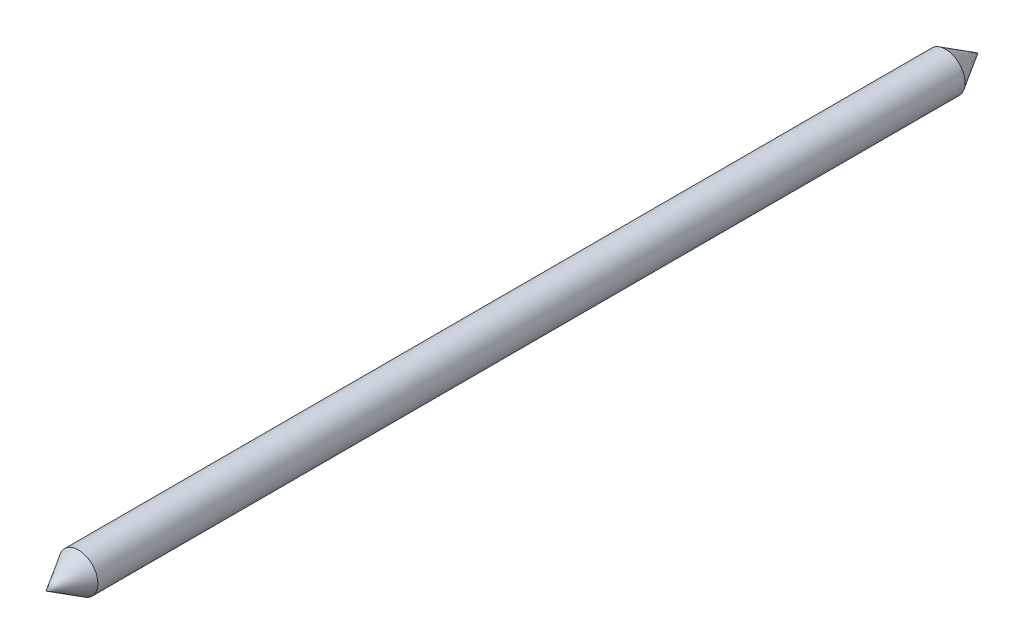
ISO-10303-21;
HEADER;
FILE_DESCRIPTION(('STEP AP214'),'2;1');
FILE_NAME('part.step','',(''),(''),'','','');
FILE_SCHEMA(('AUTOMOTIVE_DESIGN { 1 0 10303 214 1 1 1 1 }'));
ENDSEC;
DATA;
#1=APPLICATION_CONTEXT('core data for automotive mechanical design processes');
#2=APPLICATION_PROTOCOL_DEFINITION('international standard','automotive_design',2000,#1);
#3=PRODUCT_CONTEXT('',#1,'mechanical');
#4=PRODUCT('Part','Part','',(#3));
#5=PRODUCT_RELATED_PRODUCT_CATEGORY('part','',(#4));
#6=PRODUCT_DEFINITION_FORMATION('','',#4);
#7=PRODUCT_DEFINITION_CONTEXT('part definition',#1,'design');
#8=PRODUCT_DEFINITION('design','',#6,#7);
#9=PRODUCT_DEFINITION_SHAPE('','',#8);
#10=(LENGTH_UNIT() NAMED_UNIT(*) SI_UNIT(.MILLI.,.METRE.));
#11=(NAMED_UNIT(*) PLANE_ANGLE_UNIT() SI_UNIT($,.RADIAN.));
#12=(NAMED_UNIT(*) SI_UNIT($,.STERADIAN.) SOLID_ANGLE_UNIT());
#13=UNCERTAINTY_MEASURE_WITH_UNIT(LENGTH_MEASURE(1.E-05),#10,'distance_accuracy_value','');
#14=(GEOMETRIC_REPRESENTATION_CONTEXT(3) GLOBAL_UNCERTAINTY_ASSIGNED_CONTEXT((#13)) GLOBAL_UNIT_ASSIGNED_CONTEXT((#10,
#11,#12)) REPRESENTATION_CONTEXT('',''));
#15=CARTESIAN_POINT('',(0.,0.,0.));
#16=DIRECTION('',(0.,0.,1.));
#17=DIRECTION('',(1.,0.,0.));
#18=AXIS2_PLACEMENT_3D('',#15,#16,#17);
#19=CARTESIAN_POINT('',(0.,0.,-169.8625));
#20=DIRECTION('',(0.,0.,1.));
#21=DIRECTION('',(1.,0.,0.));
#22=AXIS2_PLACEMENT_3D('',#19,#20,#21);
#23=CONICAL_SURFACE('',#22,7.62000000000011,0.54041950027059);
#24=CARTESIAN_POINT('',(0.,0.,-182.5625));
#25=VERTEX_POINT('',#24);
#26=VERTEX_LOOP('',#25);
#27=FACE_BOUND('',#26,.T.);
#28=CARTESIAN_POINT('',(0.,0.,-169.8625));
#29=DIRECTION('',(0.,0.,-1.));
#30=DIRECTION('',(-1.,0.,0.));
#31=AXIS2_PLACEMENT_3D('',#28,#29,#30);
#32=CIRCLE('',#31,7.62000000000011);
#33=CARTESIAN_POINT('',(-7.62000000000017,0.,-169.8625));
#34=VERTEX_POINT('',#33);
#35=EDGE_CURVE('E11',#34,#34,#32,.T.);
#36=ORIENTED_EDGE('',*,*,#35,.T.);
#37=EDGE_LOOP('',(#36));
#38=FACE_BOUND('',#37,.T.);
#39=ADVANCED_FACE('F45',(#27,#38),#23,.T.);
#40=CARTESIAN_POINT('',(0.,0.,-182.5625));
#41=DIRECTION('',(0.,0.,-1.));
#42=DIRECTION('',(-1.,0.,0.));
#43=AXIS2_PLACEMENT_3D('',#40,#41,#42);
#44=CYLINDRICAL_SURFACE('',#43,7.62000000000005);
#45=ORIENTED_EDGE('',*,*,#35,.F.);
#46=EDGE_LOOP('',(#45));
#47=FACE_BOUND('',#46,.T.);
#48=CARTESIAN_POINT('',(0.,0.,169.8625));
#49=DIRECTION('',(0.,0.,-1.));
#50=DIRECTION('',(-1.,0.,0.));
#51=AXIS2_PLACEMENT_3D('',#48,#49,#50);
#52=CIRCLE('',#51,7.62);
#53=CARTESIAN_POINT('',(-7.61999999999996,0.,169.8625));
#54=VERTEX_POINT('',#53);
#55=EDGE_CURVE('E53',#54,#54,#52,.T.);
#56=ORIENTED_EDGE('',*,*,#55,.T.);
#57=EDGE_LOOP('',(#56));
#58=FACE_BOUND('',#57,.T.);
#59=ADVANCED_FACE('F61',(#47,#58),#44,.T.);
#60=CARTESIAN_POINT('',(0.,0.,182.5625));
#61=DIRECTION('',(0.,0.,-1.));
#62=DIRECTION('',(-1.,0.,0.));
#63=AXIS2_PLACEMENT_3D('',#60,#61,#62);
#64=CONICAL_SURFACE('',#63,0.,0.540419500270585);
#65=ORIENTED_EDGE('',*,*,#55,.F.);
#66=EDGE_LOOP('',(#65));
#67=FACE_BOUND('',#66,.T.);
#68=CARTESIAN_POINT('',(0.,0.,182.5625));
#69=VERTEX_POINT('',#68);
#70=VERTEX_LOOP('',#69);
#71=FACE_BOUND('',#70,.T.);
#72=ADVANCED_FACE('F66',(#67,#71),#64,.T.);
#73=CLOSED_SHELL('',(#39,#59,#72));
#74=MANIFOLD_SOLID_BREP('B2',#73);
#75=ADVANCED_BREP_SHAPE_REPRESENTATION('',(#18,#74),#14);
#76=SHAPE_DEFINITION_REPRESENTATION(#9,#75);
ENDSEC;
END-ISO-10303-21;
